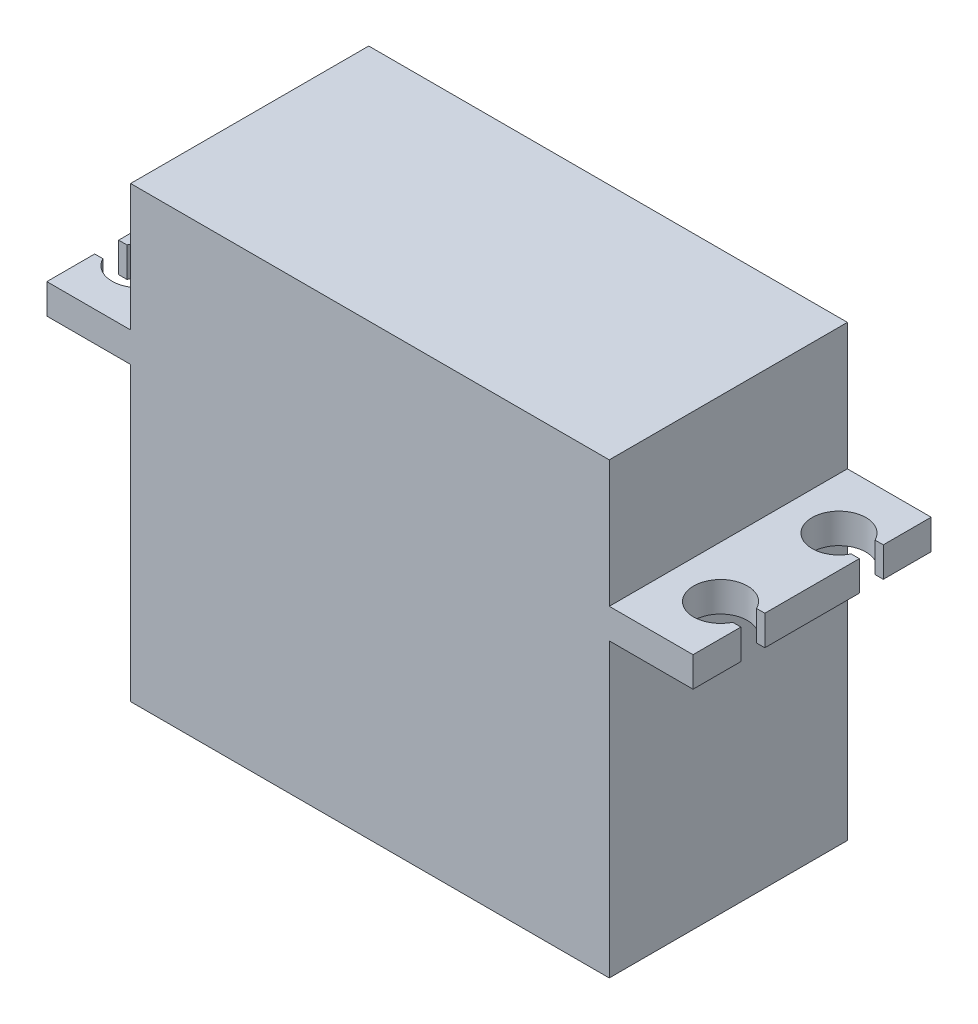
ISO-10303-21;
HEADER;
FILE_DESCRIPTION(('STEP AP214'),'2;1');
FILE_NAME('part.step','',(''),(''),'','','');
FILE_SCHEMA(('AUTOMOTIVE_DESIGN { 1 0 10303 214 1 1 1 1 }'));
ENDSEC;
DATA;
#1=APPLICATION_CONTEXT('core data for automotive mechanical design processes');
#2=APPLICATION_PROTOCOL_DEFINITION('international standard','automotive_design',2000,#1);
#3=PRODUCT_CONTEXT('',#1,'mechanical');
#4=PRODUCT('Part','Part','',(#3));
#5=PRODUCT_RELATED_PRODUCT_CATEGORY('part','',(#4));
#6=PRODUCT_DEFINITION_FORMATION('','',#4);
#7=PRODUCT_DEFINITION_CONTEXT('part definition',#1,'design');
#8=PRODUCT_DEFINITION('design','',#6,#7);
#9=PRODUCT_DEFINITION_SHAPE('','',#8);
#10=(LENGTH_UNIT() NAMED_UNIT(*) SI_UNIT(.MILLI.,.METRE.));
#11=(NAMED_UNIT(*) PLANE_ANGLE_UNIT() SI_UNIT($,.RADIAN.));
#12=(NAMED_UNIT(*) SI_UNIT($,.STERADIAN.) SOLID_ANGLE_UNIT());
#13=UNCERTAINTY_MEASURE_WITH_UNIT(LENGTH_MEASURE(1.E-05),#10,'distance_accuracy_value','');
#14=(GEOMETRIC_REPRESENTATION_CONTEXT(3) GLOBAL_UNCERTAINTY_ASSIGNED_CONTEXT((#13)) GLOBAL_UNIT_ASSIGNED_CONTEXT((#10,
#11,#12)) REPRESENTATION_CONTEXT('',''));
#15=CARTESIAN_POINT('',(0.,0.,0.));
#16=DIRECTION('',(0.,0.,1.));
#17=DIRECTION('',(1.,0.,0.));
#18=AXIS2_PLACEMENT_3D('',#15,#16,#17);
#19=CARTESIAN_POINT('',(-27.,5.65,0.));
#20=DIRECTION('',(1.,0.,0.));
#21=DIRECTION('',(0.,0.,-1.));
#22=AXIS2_PLACEMENT_3D('',#19,#20,#21);
#23=PLANE('',#22);
#24=DIRECTION('',(0.,0.,-1.));
#25=VECTOR('',#24,1.);
#26=CARTESIAN_POINT('',(-27.,8.15,0.));
#27=LINE('',#26,#25);
#28=CARTESIAN_POINT('',(-27.,8.15,19.9));
#29=VERTEX_POINT('',#28);
#30=CARTESIAN_POINT('',(-27.0000000000001,8.15,15.9));
#31=VERTEX_POINT('',#30);
#32=EDGE_CURVE('E383',#29,#31,#27,.T.);
#33=ORIENTED_EDGE('',*,*,#32,.T.);
#34=DIRECTION('',(0.,1.,0.));
#35=VECTOR('',#34,1.);
#36=CARTESIAN_POINT('',(-27.0000000000001,-18.75,15.9));
#37=LINE('',#36,#35);
#38=CARTESIAN_POINT('',(-27.0000000000001,5.64999999999999,15.9));
#39=VERTEX_POINT('',#38);
#40=EDGE_CURVE('E282',#39,#31,#37,.T.);
#41=ORIENTED_EDGE('',*,*,#40,.F.);
#42=DIRECTION('',(0.,0.,-1.));
#43=VECTOR('',#42,1.);
#44=CARTESIAN_POINT('',(-27.,5.65,0.));
#45=LINE('',#44,#43);
#46=CARTESIAN_POINT('',(-27.,5.65,19.9));
#47=VERTEX_POINT('',#46);
#48=EDGE_CURVE('E371',#47,#39,#45,.T.);
#49=ORIENTED_EDGE('',*,*,#48,.F.);
#50=DIRECTION('',(0.,1.,0.));
#51=VECTOR('',#50,1.);
#52=CARTESIAN_POINT('',(-27.,5.65,19.9));
#53=LINE('',#52,#51);
#54=EDGE_CURVE('E391',#47,#29,#53,.T.);
#55=ORIENTED_EDGE('',*,*,#54,.T.);
#56=EDGE_LOOP('',(#33,#41,#49,#55));
#57=FACE_BOUND('',#56,.T.);
#58=ADVANCED_FACE('F37',(#57),#23,.F.);
#59=CARTESIAN_POINT('',(-27.0000000000001,5.64999999999999,13.9));
#60=VERTEX_POINT('',#59);
#61=CARTESIAN_POINT('',(-27.0000000000001,5.64999999999999,6.));
#62=VERTEX_POINT('',#61);
#63=EDGE_CURVE('E375',#60,#62,#45,.T.);
#64=ORIENTED_EDGE('',*,*,#63,.F.);
#65=DIRECTION('',(0.,1.,0.));
#66=VECTOR('',#65,1.);
#67=CARTESIAN_POINT('',(-27.0000000000001,-18.75,13.9));
#68=LINE('',#67,#66);
#69=CARTESIAN_POINT('',(-27.0000000000001,8.15,13.9));
#70=VERTEX_POINT('',#69);
#71=EDGE_CURVE('E284',#60,#70,#68,.T.);
#72=ORIENTED_EDGE('',*,*,#71,.T.);
#73=CARTESIAN_POINT('',(-27.0000000000001,8.15,6.));
#74=VERTEX_POINT('',#73);
#75=EDGE_CURVE('E386',#70,#74,#27,.T.);
#76=ORIENTED_EDGE('',*,*,#75,.T.);
#77=DIRECTION('',(0.,1.,0.));
#78=VECTOR('',#77,1.);
#79=CARTESIAN_POINT('',(-27.0000000000001,-18.75,6.));
#80=LINE('',#79,#78);
#81=EDGE_CURVE('E268',#62,#74,#80,.T.);
#82=ORIENTED_EDGE('',*,*,#81,.F.);
#83=EDGE_LOOP('',(#64,#72,#76,#82));
#84=FACE_BOUND('',#83,.T.);
#85=ADVANCED_FACE('F485',(#84),#23,.F.);
#86=CARTESIAN_POINT('',(27.,5.65,0.));
#87=DIRECTION('',(-1.,0.,0.));
#88=DIRECTION('',(0.,0.,1.));
#89=AXIS2_PLACEMENT_3D('',#86,#87,#88);
#90=PLANE('',#89);
#91=DIRECTION('',(0.,0.,1.));
#92=VECTOR('',#91,1.);
#93=CARTESIAN_POINT('',(27.,5.65,0.));
#94=LINE('',#93,#92);
#95=CARTESIAN_POINT('',(27.,5.64999999999999,6.));
#96=VERTEX_POINT('',#95);
#97=CARTESIAN_POINT('',(27.,5.64999999999999,13.9));
#98=VERTEX_POINT('',#97);
#99=EDGE_CURVE('E345',#96,#98,#94,.T.);
#100=ORIENTED_EDGE('',*,*,#99,.F.);
#101=DIRECTION('',(0.,1.,0.));
#102=VECTOR('',#101,1.);
#103=CARTESIAN_POINT('',(27.,-18.75,6.));
#104=LINE('',#103,#102);
#105=CARTESIAN_POINT('',(27.,8.15,6.));
#106=VERTEX_POINT('',#105);
#107=EDGE_CURVE('E253',#96,#106,#104,.T.);
#108=ORIENTED_EDGE('',*,*,#107,.T.);
#109=DIRECTION('',(0.,0.,1.));
#110=VECTOR('',#109,1.);
#111=CARTESIAN_POINT('',(27.,8.15,0.));
#112=LINE('',#111,#110);
#113=CARTESIAN_POINT('',(27.,8.15,13.9));
#114=VERTEX_POINT('',#113);
#115=EDGE_CURVE('E355',#106,#114,#112,.T.);
#116=ORIENTED_EDGE('',*,*,#115,.T.);
#117=DIRECTION('',(0.,1.,0.));
#118=VECTOR('',#117,1.);
#119=CARTESIAN_POINT('',(27.,-18.75,13.9));
#120=LINE('',#119,#118);
#121=EDGE_CURVE('E295',#98,#114,#120,.T.);
#122=ORIENTED_EDGE('',*,*,#121,.F.);
#123=EDGE_LOOP('',(#100,#108,#116,#122));
#124=FACE_BOUND('',#123,.T.);
#125=ADVANCED_FACE('F506',(#124),#90,.F.);
#126=CARTESIAN_POINT('',(27.,5.64999999999999,15.9));
#127=VERTEX_POINT('',#126);
#128=CARTESIAN_POINT('',(27.,5.65,19.9));
#129=VERTEX_POINT('',#128);
#130=EDGE_CURVE('E340',#127,#129,#94,.T.);
#131=ORIENTED_EDGE('',*,*,#130,.F.);
#132=DIRECTION('',(0.,1.,0.));
#133=VECTOR('',#132,1.);
#134=CARTESIAN_POINT('',(27.,-18.75,15.9));
#135=LINE('',#134,#133);
#136=CARTESIAN_POINT('',(27.,8.15,15.9));
#137=VERTEX_POINT('',#136);
#138=EDGE_CURVE('E296',#127,#137,#135,.T.);
#139=ORIENTED_EDGE('',*,*,#138,.T.);
#140=CARTESIAN_POINT('',(27.,8.15,19.9));
#141=VERTEX_POINT('',#140);
#142=EDGE_CURVE('E352',#137,#141,#112,.T.);
#143=ORIENTED_EDGE('',*,*,#142,.T.);
#144=DIRECTION('',(0.,1.,0.));
#145=VECTOR('',#144,1.);
#146=CARTESIAN_POINT('',(27.,5.65,19.9));
#147=LINE('',#146,#145);
#148=EDGE_CURVE('E348',#129,#141,#147,.T.);
#149=ORIENTED_EDGE('',*,*,#148,.F.);
#150=EDGE_LOOP('',(#131,#139,#143,#149));
#151=FACE_BOUND('',#150,.T.);
#152=ADVANCED_FACE('F532',(#151),#90,.F.);
#153=CARTESIAN_POINT('',(20.,-18.75,19.9));
#154=DIRECTION('',(-1.,0.,0.));
#155=DIRECTION('',(0.,0.,1.));
#156=AXIS2_PLACEMENT_3D('',#153,#154,#155);
#157=PLANE('',#156);
#158=DIRECTION('',(0.,0.,-1.));
#159=VECTOR('',#158,1.);
#160=CARTESIAN_POINT('',(20.,5.65,19.9));
#161=LINE('',#160,#159);
#162=CARTESIAN_POINT('',(20.,5.65,19.9));
#163=VERTEX_POINT('',#162);
#164=CARTESIAN_POINT('',(20.,5.65,0.));
#165=VERTEX_POINT('',#164);
#166=EDGE_CURVE('E334',#163,#165,#161,.T.);
#167=ORIENTED_EDGE('',*,*,#166,.F.);
#168=DIRECTION('',(0.,1.,0.));
#169=VECTOR('',#168,1.);
#170=CARTESIAN_POINT('',(20.,-18.75,19.9));
#171=LINE('',#170,#169);
#172=CARTESIAN_POINT('',(20.,-18.75,19.9));
#173=VERTEX_POINT('',#172);
#174=EDGE_CURVE('E395',#173,#163,#171,.T.);
#175=ORIENTED_EDGE('',*,*,#174,.F.);
#176=DIRECTION('',(0.,0.,-1.));
#177=VECTOR('',#176,1.);
#178=CARTESIAN_POINT('',(20.,-18.75,19.9));
#179=LINE('',#178,#177);
#180=CARTESIAN_POINT('',(20.,-18.75,0.));
#181=VERTEX_POINT('',#180);
#182=EDGE_CURVE('E407',#173,#181,#179,.T.);
#183=ORIENTED_EDGE('',*,*,#182,.T.);
#184=DIRECTION('',(0.,1.,0.));
#185=VECTOR('',#184,1.);
#186=CARTESIAN_POINT('',(20.,-18.75,0.));
#187=LINE('',#186,#185);
#188=EDGE_CURVE('E408',#181,#165,#187,.T.);
#189=ORIENTED_EDGE('',*,*,#188,.T.);
#190=EDGE_LOOP('',(#167,#175,#183,#189));
#191=FACE_BOUND('',#190,.T.);
#192=ADVANCED_FACE('F465',(#191),#157,.F.);
#193=CARTESIAN_POINT('',(-20.,-18.75,19.9));
#194=DIRECTION('',(1.,0.,0.));
#195=DIRECTION('',(0.,0.,-1.));
#196=AXIS2_PLACEMENT_3D('',#193,#194,#195);
#197=PLANE('',#196);
#198=DIRECTION('',(0.,0.,1.));
#199=VECTOR('',#198,1.);
#200=CARTESIAN_POINT('',(-20.,5.65,19.9));
#201=LINE('',#200,#199);
#202=CARTESIAN_POINT('',(-20.,5.65,0.));
#203=VERTEX_POINT('',#202);
#204=CARTESIAN_POINT('',(-20.,5.65,19.9));
#205=VERTEX_POINT('',#204);
#206=EDGE_CURVE('E364',#203,#205,#201,.T.);
#207=ORIENTED_EDGE('',*,*,#206,.F.);
#208=DIRECTION('',(0.,-1.,0.));
#209=VECTOR('',#208,1.);
#210=CARTESIAN_POINT('',(-20.,-18.75,0.));
#211=LINE('',#210,#209);
#212=CARTESIAN_POINT('',(-20.,-18.75,0.));
#213=VERTEX_POINT('',#212);
#214=EDGE_CURVE('E412',#203,#213,#211,.T.);
#215=ORIENTED_EDGE('',*,*,#214,.T.);
#216=DIRECTION('',(0.,0.,-1.));
#217=VECTOR('',#216,1.);
#218=CARTESIAN_POINT('',(-20.,-18.75,19.9));
#219=LINE('',#218,#217);
#220=CARTESIAN_POINT('',(-20.,-18.75,19.9));
#221=VERTEX_POINT('',#220);
#222=EDGE_CURVE('E419',#221,#213,#219,.T.);
#223=ORIENTED_EDGE('',*,*,#222,.F.);
#224=DIRECTION('',(0.,-1.,0.));
#225=VECTOR('',#224,1.);
#226=CARTESIAN_POINT('',(-20.,-18.75,19.9));
#227=LINE('',#226,#225);
#228=EDGE_CURVE('E401',#205,#221,#227,.T.);
#229=ORIENTED_EDGE('',*,*,#228,.F.);
#230=EDGE_LOOP('',(#207,#215,#223,#229));
#231=FACE_BOUND('',#230,.T.);
#232=ADVANCED_FACE('F523',(#231),#197,.F.);
#233=CARTESIAN_POINT('',(20.,8.15,19.9));
#234=VERTEX_POINT('',#233);
#235=CARTESIAN_POINT('',(20.,18.75,19.9));
#236=VERTEX_POINT('',#235);
#237=EDGE_CURVE('E399',#234,#236,#171,.T.);
#238=ORIENTED_EDGE('',*,*,#237,.F.);
#239=DIRECTION('',(0.,0.,-1.));
#240=VECTOR('',#239,1.);
#241=CARTESIAN_POINT('',(20.,8.15,19.9));
#242=LINE('',#241,#240);
#243=CARTESIAN_POINT('',(20.,8.15,0.));
#244=VERTEX_POINT('',#243);
#245=EDGE_CURVE('E333',#234,#244,#242,.T.);
#246=ORIENTED_EDGE('',*,*,#245,.T.);
#247=CARTESIAN_POINT('',(20.,18.75,0.));
#248=VERTEX_POINT('',#247);
#249=EDGE_CURVE('E394',#244,#248,#187,.T.);
#250=ORIENTED_EDGE('',*,*,#249,.T.);
#251=DIRECTION('',(0.,0.,-1.));
#252=VECTOR('',#251,1.);
#253=CARTESIAN_POINT('',(20.,18.75,19.9));
#254=LINE('',#253,#252);
#255=EDGE_CURVE('E11',#236,#248,#254,.T.);
#256=ORIENTED_EDGE('',*,*,#255,.F.);
#257=EDGE_LOOP('',(#238,#246,#250,#256));
#258=FACE_BOUND('',#257,.T.);
#259=ADVANCED_FACE('F39',(#258),#157,.F.);
#260=CARTESIAN_POINT('',(-20.,18.75,19.9));
#261=DIRECTION('',(0.,-1.,0.));
#262=DIRECTION('',(0.,0.,-1.));
#263=AXIS2_PLACEMENT_3D('',#260,#261,#262);
#264=PLANE('',#263);
#265=DIRECTION('',(-1.,0.,0.));
#266=VECTOR('',#265,1.);
#267=CARTESIAN_POINT('',(-20.,18.75,0.));
#268=LINE('',#267,#266);
#269=CARTESIAN_POINT('',(-20.,18.75,0.));
#270=VERTEX_POINT('',#269);
#271=EDGE_CURVE('E410',#248,#270,#268,.T.);
#272=ORIENTED_EDGE('',*,*,#271,.T.);
#273=DIRECTION('',(0.,0.,-1.));
#274=VECTOR('',#273,1.);
#275=CARTESIAN_POINT('',(-20.,18.75,19.9));
#276=LINE('',#275,#274);
#277=CARTESIAN_POINT('',(-20.,18.75,19.9));
#278=VERTEX_POINT('',#277);
#279=EDGE_CURVE('E45',#278,#270,#276,.T.);
#280=ORIENTED_EDGE('',*,*,#279,.F.);
#281=DIRECTION('',(-1.,0.,0.));
#282=VECTOR('',#281,1.);
#283=CARTESIAN_POINT('',(-20.,18.75,19.9));
#284=LINE('',#283,#282);
#285=EDGE_CURVE('E398',#236,#278,#284,.T.);
#286=ORIENTED_EDGE('',*,*,#285,.F.);
#287=ORIENTED_EDGE('',*,*,#255,.T.);
#288=EDGE_LOOP('',(#272,#280,#286,#287));
#289=FACE_BOUND('',#288,.T.);
#290=ADVANCED_FACE('F448',(#289),#264,.F.);
#291=CARTESIAN_POINT('',(-20.,8.15,0.));
#292=VERTEX_POINT('',#291);
#293=EDGE_CURVE('E413',#270,#292,#211,.T.);
#294=ORIENTED_EDGE('',*,*,#293,.T.);
#295=DIRECTION('',(0.,0.,1.));
#296=VECTOR('',#295,1.);
#297=CARTESIAN_POINT('',(-20.,8.15,19.9));
#298=LINE('',#297,#296);
#299=CARTESIAN_POINT('',(-20.,8.15,19.9));
#300=VERTEX_POINT('',#299);
#301=EDGE_CURVE('E363',#292,#300,#298,.T.);
#302=ORIENTED_EDGE('',*,*,#301,.T.);
#303=EDGE_CURVE('E402',#278,#300,#227,.T.);
#304=ORIENTED_EDGE('',*,*,#303,.F.);
#305=ORIENTED_EDGE('',*,*,#279,.T.);
#306=EDGE_LOOP('',(#294,#302,#304,#305));
#307=FACE_BOUND('',#306,.T.);
#308=ADVANCED_FACE('F426',(#307),#197,.F.);
#309=CARTESIAN_POINT('',(-20.,-18.75,19.9));
#310=DIRECTION('',(0.,1.,0.));
#311=DIRECTION('',(0.,0.,1.));
#312=AXIS2_PLACEMENT_3D('',#309,#310,#311);
#313=PLANE('',#312);
#314=DIRECTION('',(1.,0.,0.));
#315=VECTOR('',#314,1.);
#316=CARTESIAN_POINT('',(-20.,-18.75,0.));
#317=LINE('',#316,#315);
#318=EDGE_CURVE('E415',#213,#181,#317,.T.);
#319=ORIENTED_EDGE('',*,*,#318,.T.);
#320=ORIENTED_EDGE('',*,*,#182,.F.);
#321=DIRECTION('',(1.,0.,0.));
#322=VECTOR('',#321,1.);
#323=CARTESIAN_POINT('',(-20.,-18.75,19.9));
#324=LINE('',#323,#322);
#325=EDGE_CURVE('E405',#221,#173,#324,.T.);
#326=ORIENTED_EDGE('',*,*,#325,.F.);
#327=ORIENTED_EDGE('',*,*,#222,.T.);
#328=EDGE_LOOP('',(#319,#320,#326,#327));
#329=FACE_BOUND('',#328,.T.);
#330=ADVANCED_FACE('F471',(#329),#313,.F.);
#331=CARTESIAN_POINT('',(0.,0.,19.9));
#332=DIRECTION('',(0.,0.,-1.));
#333=DIRECTION('',(-1.,0.,0.));
#334=AXIS2_PLACEMENT_3D('',#331,#332,#333);
#335=PLANE('',#334);
#336=ORIENTED_EDGE('',*,*,#174,.T.);
#337=DIRECTION('',(-1.,0.,0.));
#338=VECTOR('',#337,1.);
#339=CARTESIAN_POINT('',(27.,5.65,19.9));
#340=LINE('',#339,#338);
#341=EDGE_CURVE('E344',#129,#163,#340,.T.);
#342=ORIENTED_EDGE('',*,*,#341,.F.);
#343=ORIENTED_EDGE('',*,*,#148,.T.);
#344=DIRECTION('',(-1.,0.,0.));
#345=VECTOR('',#344,1.);
#346=CARTESIAN_POINT('',(27.,8.15,19.9));
#347=LINE('',#346,#345);
#348=EDGE_CURVE('E338',#141,#234,#347,.T.);
#349=ORIENTED_EDGE('',*,*,#348,.T.);
#350=ORIENTED_EDGE('',*,*,#237,.T.);
#351=ORIENTED_EDGE('',*,*,#285,.T.);
#352=ORIENTED_EDGE('',*,*,#303,.T.);
#353=DIRECTION('',(-1.,0.,0.));
#354=VECTOR('',#353,1.);
#355=CARTESIAN_POINT('',(-27.,8.15,19.9));
#356=LINE('',#355,#354);
#357=EDGE_CURVE('E380',#300,#29,#356,.T.);
#358=ORIENTED_EDGE('',*,*,#357,.T.);
#359=ORIENTED_EDGE('',*,*,#54,.F.);
#360=DIRECTION('',(-1.,0.,0.));
#361=VECTOR('',#360,1.);
#362=CARTESIAN_POINT('',(-27.,5.65,19.9));
#363=LINE('',#362,#361);
#364=EDGE_CURVE('E367',#205,#47,#363,.T.);
#365=ORIENTED_EDGE('',*,*,#364,.F.);
#366=ORIENTED_EDGE('',*,*,#228,.T.);
#367=ORIENTED_EDGE('',*,*,#325,.T.);
#368=EDGE_LOOP('',(#336,#342,#343,#349,#350,#351,#352,#358,#359,#365,#366,#367));
#369=FACE_BOUND('',#368,.T.);
#370=ADVANCED_FACE('F445',(#369),#335,.F.);
#371=CARTESIAN_POINT('',(0.,0.,0.));
#372=DIRECTION('',(0.,0.,-1.));
#373=DIRECTION('',(-1.,0.,0.));
#374=AXIS2_PLACEMENT_3D('',#371,#372,#373);
#375=PLANE('',#374);
#376=ORIENTED_EDGE('',*,*,#188,.F.);
#377=ORIENTED_EDGE('',*,*,#318,.F.);
#378=ORIENTED_EDGE('',*,*,#214,.F.);
#379=DIRECTION('',(1.,0.,0.));
#380=VECTOR('',#379,1.);
#381=CARTESIAN_POINT('',(-20.,5.65,0.));
#382=LINE('',#381,#380);
#383=CARTESIAN_POINT('',(-27.,5.65,0.));
#384=VERTEX_POINT('',#383);
#385=EDGE_CURVE('E374',#384,#203,#382,.T.);
#386=ORIENTED_EDGE('',*,*,#385,.F.);
#387=DIRECTION('',(0.,1.,0.));
#388=VECTOR('',#387,1.);
#389=CARTESIAN_POINT('',(-27.,5.65,0.));
#390=LINE('',#389,#388);
#391=CARTESIAN_POINT('',(-27.,8.15,0.));
#392=VERTEX_POINT('',#391);
#393=EDGE_CURVE('E378',#384,#392,#390,.T.);
#394=ORIENTED_EDGE('',*,*,#393,.T.);
#395=DIRECTION('',(1.,0.,0.));
#396=VECTOR('',#395,1.);
#397=CARTESIAN_POINT('',(-20.,8.15,0.));
#398=LINE('',#397,#396);
#399=EDGE_CURVE('E368',#392,#292,#398,.T.);
#400=ORIENTED_EDGE('',*,*,#399,.T.);
#401=ORIENTED_EDGE('',*,*,#293,.F.);
#402=ORIENTED_EDGE('',*,*,#271,.F.);
#403=ORIENTED_EDGE('',*,*,#249,.F.);
#404=DIRECTION('',(1.,0.,0.));
#405=VECTOR('',#404,1.);
#406=CARTESIAN_POINT('',(20.,8.15,0.));
#407=LINE('',#406,#405);
#408=CARTESIAN_POINT('',(27.,8.15,0.));
#409=VERTEX_POINT('',#408);
#410=EDGE_CURVE('E350',#244,#409,#407,.T.);
#411=ORIENTED_EDGE('',*,*,#410,.T.);
#412=DIRECTION('',(0.,1.,0.));
#413=VECTOR('',#412,1.);
#414=CARTESIAN_POINT('',(27.,5.65,0.));
#415=LINE('',#414,#413);
#416=CARTESIAN_POINT('',(27.,5.65,0.));
#417=VERTEX_POINT('',#416);
#418=EDGE_CURVE('E360',#417,#409,#415,.T.);
#419=ORIENTED_EDGE('',*,*,#418,.F.);
#420=DIRECTION('',(1.,0.,0.));
#421=VECTOR('',#420,1.);
#422=CARTESIAN_POINT('',(20.,5.65,0.));
#423=LINE('',#422,#421);
#424=EDGE_CURVE('E337',#165,#417,#423,.T.);
#425=ORIENTED_EDGE('',*,*,#424,.F.);
#426=EDGE_LOOP('',(#376,#377,#378,#386,#394,#400,#401,#402,#403,#411,#419,#425));
#427=FACE_BOUND('',#426,.T.);
#428=ADVANCED_FACE('F432',(#427),#375,.T.);
#429=CARTESIAN_POINT('',(-27.0000000000001,5.64999999999999,4.));
#430=VERTEX_POINT('',#429);
#431=EDGE_CURVE('E370',#430,#384,#45,.T.);
#432=ORIENTED_EDGE('',*,*,#431,.F.);
#433=DIRECTION('',(0.,1.,0.));
#434=VECTOR('',#433,1.);
#435=CARTESIAN_POINT('',(-27.0000000000001,-18.75,4.));
#436=LINE('',#435,#434);
#437=CARTESIAN_POINT('',(-27.0000000000001,8.15,4.));
#438=VERTEX_POINT('',#437);
#439=EDGE_CURVE('E270',#430,#438,#436,.T.);
#440=ORIENTED_EDGE('',*,*,#439,.T.);
#441=EDGE_CURVE('E382',#438,#392,#27,.T.);
#442=ORIENTED_EDGE('',*,*,#441,.T.);
#443=ORIENTED_EDGE('',*,*,#393,.F.);
#444=EDGE_LOOP('',(#432,#440,#442,#443));
#445=FACE_BOUND('',#444,.T.);
#446=ADVANCED_FACE('F478',(#445),#23,.F.);
#447=CARTESIAN_POINT('',(0.,5.65,0.));
#448=DIRECTION('',(0.,1.,0.));
#449=DIRECTION('',(0.,0.,1.));
#450=AXIS2_PLACEMENT_3D('',#447,#448,#449);
#451=PLANE('',#450);
#452=ORIENTED_EDGE('',*,*,#48,.T.);
#453=DIRECTION('',(1.,0.,0.));
#454=VECTOR('',#453,1.);
#455=CARTESIAN_POINT('',(0.,5.65,15.8999999999999));
#456=LINE('',#455,#454);
#457=CARTESIAN_POINT('',(-26.3155644370746,5.64999999999999,15.9));
#458=VERTEX_POINT('',#457);
#459=EDGE_CURVE('E327',#39,#458,#456,.T.);
#460=ORIENTED_EDGE('',*,*,#459,.T.);
#461=CARTESIAN_POINT('',(-24.3,5.65,14.9));
#462=DIRECTION('',(0.,1.,0.));
#463=DIRECTION('',(0.,0.,1.));
#464=AXIS2_PLACEMENT_3D('',#461,#462,#463);
#465=CIRCLE('',#464,2.25);
#466=CARTESIAN_POINT('',(-26.3155644370746,5.64999999999999,13.9));
#467=VERTEX_POINT('',#466);
#468=EDGE_CURVE('E330',#458,#467,#465,.T.);
#469=ORIENTED_EDGE('',*,*,#468,.T.);
#470=DIRECTION('',(-1.,0.,0.));
#471=VECTOR('',#470,1.);
#472=CARTESIAN_POINT('',(0.,5.65,13.9));
#473=LINE('',#472,#471);
#474=EDGE_CURVE('E324',#467,#60,#473,.T.);
#475=ORIENTED_EDGE('',*,*,#474,.T.);
#476=ORIENTED_EDGE('',*,*,#63,.T.);
#477=DIRECTION('',(1.,0.,0.));
#478=VECTOR('',#477,1.);
#479=CARTESIAN_POINT('',(0.,5.65,6.0000000000001));
#480=LINE('',#479,#478);
#481=CARTESIAN_POINT('',(-26.3155644370746,5.64999999999999,6.));
#482=VERTEX_POINT('',#481);
#483=EDGE_CURVE('E318',#62,#482,#480,.T.);
#484=ORIENTED_EDGE('',*,*,#483,.T.);
#485=CARTESIAN_POINT('',(-24.3,5.65,5.));
#486=DIRECTION('',(0.,1.,0.));
#487=DIRECTION('',(0.,0.,1.));
#488=AXIS2_PLACEMENT_3D('',#485,#486,#487);
#489=CIRCLE('',#488,2.25);
#490=CARTESIAN_POINT('',(-26.3155644370746,5.64999999999999,4.));
#491=VERTEX_POINT('',#490);
#492=EDGE_CURVE('E321',#482,#491,#489,.T.);
#493=ORIENTED_EDGE('',*,*,#492,.T.);
#494=DIRECTION('',(-1.,0.,0.));
#495=VECTOR('',#494,1.);
#496=CARTESIAN_POINT('',(0.,5.65,4.00000000000003));
#497=LINE('',#496,#495);
#498=EDGE_CURVE('E315',#491,#430,#497,.T.);
#499=ORIENTED_EDGE('',*,*,#498,.T.);
#500=ORIENTED_EDGE('',*,*,#431,.T.);
#501=ORIENTED_EDGE('',*,*,#385,.T.);
#502=ORIENTED_EDGE('',*,*,#206,.T.);
#503=ORIENTED_EDGE('',*,*,#364,.T.);
#504=EDGE_LOOP('',(#452,#460,#469,#475,#476,#484,#493,#499,#500,#501,#502,#503));
#505=FACE_BOUND('',#504,.T.);
#506=ADVANCED_FACE('F475',(#505),#451,.F.);
#507=CARTESIAN_POINT('',(0.,8.15,0.));
#508=DIRECTION('',(0.,1.,0.));
#509=DIRECTION('',(0.,0.,1.));
#510=AXIS2_PLACEMENT_3D('',#507,#508,#509);
#511=PLANE('',#510);
#512=DIRECTION('',(1.,0.,0.));
#513=VECTOR('',#512,1.);
#514=CARTESIAN_POINT('',(-27.0000000000001,8.15,15.9));
#515=LINE('',#514,#513);
#516=CARTESIAN_POINT('',(-26.3155644370746,8.15,15.9));
#517=VERTEX_POINT('',#516);
#518=EDGE_CURVE('E277',#31,#517,#515,.T.);
#519=ORIENTED_EDGE('',*,*,#518,.F.);
#520=ORIENTED_EDGE('',*,*,#32,.F.);
#521=ORIENTED_EDGE('',*,*,#357,.F.);
#522=ORIENTED_EDGE('',*,*,#301,.F.);
#523=ORIENTED_EDGE('',*,*,#399,.F.);
#524=ORIENTED_EDGE('',*,*,#441,.F.);
#525=DIRECTION('',(-1.,0.,0.));
#526=VECTOR('',#525,1.);
#527=CARTESIAN_POINT('',(-27.0000000000001,8.15,4.));
#528=LINE('',#527,#526);
#529=CARTESIAN_POINT('',(-26.3155644370746,8.15,4.));
#530=VERTEX_POINT('',#529);
#531=EDGE_CURVE('E260',#530,#438,#528,.T.);
#532=ORIENTED_EDGE('',*,*,#531,.F.);
#533=CARTESIAN_POINT('',(-24.3,8.15,5.));
#534=DIRECTION('',(0.,1.,0.));
#535=DIRECTION('',(0.,0.,-1.));
#536=AXIS2_PLACEMENT_3D('',#533,#534,#535);
#537=CIRCLE('',#536,2.25);
#538=CARTESIAN_POINT('',(-26.3155644370746,8.15,6.));
#539=VERTEX_POINT('',#538);
#540=EDGE_CURVE('E60',#539,#530,#537,.T.);
#541=ORIENTED_EDGE('',*,*,#540,.F.);
#542=DIRECTION('',(1.,0.,0.));
#543=VECTOR('',#542,1.);
#544=CARTESIAN_POINT('',(-27.0000000000001,8.15,6.));
#545=LINE('',#544,#543);
#546=EDGE_CURVE('E263',#74,#539,#545,.T.);
#547=ORIENTED_EDGE('',*,*,#546,.F.);
#548=ORIENTED_EDGE('',*,*,#75,.F.);
#549=DIRECTION('',(-1.,0.,0.));
#550=VECTOR('',#549,1.);
#551=CARTESIAN_POINT('',(-27.0000000000001,8.15,13.9));
#552=LINE('',#551,#550);
#553=CARTESIAN_POINT('',(-26.3155644370746,8.15,13.9));
#554=VERTEX_POINT('',#553);
#555=EDGE_CURVE('E275',#554,#70,#552,.T.);
#556=ORIENTED_EDGE('',*,*,#555,.F.);
#557=CARTESIAN_POINT('',(-24.3,8.15,14.9));
#558=DIRECTION('',(0.,1.,0.));
#559=DIRECTION('',(0.,0.,-1.));
#560=AXIS2_PLACEMENT_3D('',#557,#558,#559);
#561=CIRCLE('',#560,2.25);
#562=EDGE_CURVE('E52',#517,#554,#561,.T.);
#563=ORIENTED_EDGE('',*,*,#562,.F.);
#564=EDGE_LOOP('',(#519,#520,#521,#522,#523,#524,#532,#541,#547,#548,#556,#563));
#565=FACE_BOUND('',#564,.T.);
#566=ADVANCED_FACE('F442',(#565),#511,.T.);
#567=CARTESIAN_POINT('',(27.,8.15,4.));
#568=VERTEX_POINT('',#567);
#569=EDGE_CURVE('E353',#409,#568,#112,.T.);
#570=ORIENTED_EDGE('',*,*,#569,.T.);
#571=DIRECTION('',(0.,1.,0.));
#572=VECTOR('',#571,1.);
#573=CARTESIAN_POINT('',(27.,-18.75,4.));
#574=LINE('',#573,#572);
#575=CARTESIAN_POINT('',(27.,5.64999999999999,4.));
#576=VERTEX_POINT('',#575);
#577=EDGE_CURVE('E236',#576,#568,#574,.T.);
#578=ORIENTED_EDGE('',*,*,#577,.F.);
#579=EDGE_CURVE('E341',#417,#576,#94,.T.);
#580=ORIENTED_EDGE('',*,*,#579,.F.);
#581=ORIENTED_EDGE('',*,*,#418,.T.);
#582=EDGE_LOOP('',(#570,#578,#580,#581));
#583=FACE_BOUND('',#582,.T.);
#584=ADVANCED_FACE('F455',(#583),#90,.F.);
#585=CARTESIAN_POINT('',(0.,5.65,0.));
#586=DIRECTION('',(0.,-1.,0.));
#587=DIRECTION('',(0.,0.,-1.));
#588=AXIS2_PLACEMENT_3D('',#585,#586,#587);
#589=PLANE('',#588);
#590=DIRECTION('',(-1.,0.,0.));
#591=VECTOR('',#590,1.);
#592=CARTESIAN_POINT('',(0.,5.65,6.0000000000001));
#593=LINE('',#592,#591);
#594=CARTESIAN_POINT('',(26.3155644370746,5.64999999999999,6.));
#595=VERTEX_POINT('',#594);
#596=EDGE_CURVE('E313',#96,#595,#593,.T.);
#597=ORIENTED_EDGE('',*,*,#596,.F.);
#598=ORIENTED_EDGE('',*,*,#99,.T.);
#599=DIRECTION('',(1.,0.,0.));
#600=VECTOR('',#599,1.);
#601=CARTESIAN_POINT('',(0.,5.65,13.9));
#602=LINE('',#601,#600);
#603=CARTESIAN_POINT('',(26.3155644370746,5.64999999999999,13.9));
#604=VERTEX_POINT('',#603);
#605=EDGE_CURVE('E299',#604,#98,#602,.T.);
#606=ORIENTED_EDGE('',*,*,#605,.F.);
#607=CARTESIAN_POINT('',(24.3,5.65,14.9));
#608=DIRECTION('',(0.,-1.,0.));
#609=DIRECTION('',(0.,0.,-1.));
#610=AXIS2_PLACEMENT_3D('',#607,#608,#609);
#611=CIRCLE('',#610,2.25);
#612=CARTESIAN_POINT('',(26.3155644370746,5.64999999999999,15.9));
#613=VERTEX_POINT('',#612);
#614=EDGE_CURVE('E306',#613,#604,#611,.T.);
#615=ORIENTED_EDGE('',*,*,#614,.F.);
#616=DIRECTION('',(-1.,0.,0.));
#617=VECTOR('',#616,1.);
#618=CARTESIAN_POINT('',(0.,5.65,15.8999999999999));
#619=LINE('',#618,#617);
#620=EDGE_CURVE('E308',#127,#613,#619,.T.);
#621=ORIENTED_EDGE('',*,*,#620,.F.);
#622=ORIENTED_EDGE('',*,*,#130,.T.);
#623=ORIENTED_EDGE('',*,*,#341,.T.);
#624=ORIENTED_EDGE('',*,*,#166,.T.);
#625=ORIENTED_EDGE('',*,*,#424,.T.);
#626=ORIENTED_EDGE('',*,*,#579,.T.);
#627=DIRECTION('',(1.,0.,0.));
#628=VECTOR('',#627,1.);
#629=CARTESIAN_POINT('',(0.,5.65,4.00000000000003));
#630=LINE('',#629,#628);
#631=CARTESIAN_POINT('',(26.3155644370746,5.64999999999999,4.));
#632=VERTEX_POINT('',#631);
#633=EDGE_CURVE('E310',#632,#576,#630,.T.);
#634=ORIENTED_EDGE('',*,*,#633,.F.);
#635=CARTESIAN_POINT('',(24.3,5.65,5.));
#636=DIRECTION('',(0.,-1.,0.));
#637=DIRECTION('',(0.,0.,-1.));
#638=AXIS2_PLACEMENT_3D('',#635,#636,#637);
#639=CIRCLE('',#638,2.25);
#640=EDGE_CURVE('E232',#595,#632,#639,.T.);
#641=ORIENTED_EDGE('',*,*,#640,.F.);
#642=EDGE_LOOP('',(#597,#598,#606,#615,#621,#622,#623,#624,#625,#626,#634,#641));
#643=FACE_BOUND('',#642,.T.);
#644=ADVANCED_FACE('F461',(#643),#589,.T.);
#645=CARTESIAN_POINT('',(0.,8.15,0.));
#646=DIRECTION('',(0.,-1.,0.));
#647=DIRECTION('',(0.,0.,-1.));
#648=AXIS2_PLACEMENT_3D('',#645,#646,#647);
#649=PLANE('',#648);
#650=ORIENTED_EDGE('',*,*,#115,.F.);
#651=DIRECTION('',(1.,0.,0.));
#652=VECTOR('',#651,1.);
#653=CARTESIAN_POINT('',(27.,8.15,6.));
#654=LINE('',#653,#652);
#655=CARTESIAN_POINT('',(26.3155644370746,8.15,6.));
#656=VERTEX_POINT('',#655);
#657=EDGE_CURVE('E249',#656,#106,#654,.T.);
#658=ORIENTED_EDGE('',*,*,#657,.F.);
#659=CARTESIAN_POINT('',(24.3,8.15,5.));
#660=DIRECTION('',(0.,1.,0.));
#661=DIRECTION('',(0.,0.,1.));
#662=AXIS2_PLACEMENT_3D('',#659,#660,#661);
#663=CIRCLE('',#662,2.25);
#664=CARTESIAN_POINT('',(26.3155644370746,8.15,4.));
#665=VERTEX_POINT('',#664);
#666=EDGE_CURVE('E229',#665,#656,#663,.T.);
#667=ORIENTED_EDGE('',*,*,#666,.F.);
#668=DIRECTION('',(-1.,0.,0.));
#669=VECTOR('',#668,1.);
#670=CARTESIAN_POINT('',(27.,8.15,4.));
#671=LINE('',#670,#669);
#672=EDGE_CURVE('E239',#568,#665,#671,.T.);
#673=ORIENTED_EDGE('',*,*,#672,.F.);
#674=ORIENTED_EDGE('',*,*,#569,.F.);
#675=ORIENTED_EDGE('',*,*,#410,.F.);
#676=ORIENTED_EDGE('',*,*,#245,.F.);
#677=ORIENTED_EDGE('',*,*,#348,.F.);
#678=ORIENTED_EDGE('',*,*,#142,.F.);
#679=DIRECTION('',(1.,0.,0.));
#680=VECTOR('',#679,1.);
#681=CARTESIAN_POINT('',(27.,8.15,15.9));
#682=LINE('',#681,#680);
#683=CARTESIAN_POINT('',(26.3155644370746,8.15,15.9));
#684=VERTEX_POINT('',#683);
#685=EDGE_CURVE('E293',#684,#137,#682,.T.);
#686=ORIENTED_EDGE('',*,*,#685,.F.);
#687=CARTESIAN_POINT('',(24.3,8.15,14.9));
#688=DIRECTION('',(0.,1.,0.));
#689=DIRECTION('',(0.,0.,1.));
#690=AXIS2_PLACEMENT_3D('',#687,#688,#689);
#691=CIRCLE('',#690,2.25);
#692=CARTESIAN_POINT('',(26.3155644370746,8.15,13.9));
#693=VERTEX_POINT('',#692);
#694=EDGE_CURVE('E290',#693,#684,#691,.T.);
#695=ORIENTED_EDGE('',*,*,#694,.F.);
#696=DIRECTION('',(-1.,0.,0.));
#697=VECTOR('',#696,1.);
#698=CARTESIAN_POINT('',(27.,8.15,13.9));
#699=LINE('',#698,#697);
#700=EDGE_CURVE('E256',#114,#693,#699,.T.);
#701=ORIENTED_EDGE('',*,*,#700,.F.);
#702=EDGE_LOOP('',(#650,#658,#667,#673,#674,#675,#676,#677,#678,#686,#695,#701));
#703=FACE_BOUND('',#702,.T.);
#704=ADVANCED_FACE('F248',(#703),#649,.F.);
#705=CARTESIAN_POINT('',(27.,-18.75,15.9));
#706=DIRECTION('',(0.,0.,1.));
#707=DIRECTION('',(1.,0.,0.));
#708=AXIS2_PLACEMENT_3D('',#705,#706,#707);
#709=PLANE('',#708);
#710=ORIENTED_EDGE('',*,*,#620,.T.);
#711=DIRECTION('',(0.,1.,0.));
#712=VECTOR('',#711,1.);
#713=CARTESIAN_POINT('',(26.3155644370746,-18.75,15.9));
#714=LINE('',#713,#712);
#715=EDGE_CURVE('E300',#613,#684,#714,.T.);
#716=ORIENTED_EDGE('',*,*,#715,.T.);
#717=ORIENTED_EDGE('',*,*,#685,.T.);
#718=ORIENTED_EDGE('',*,*,#138,.F.);
#719=EDGE_LOOP('',(#710,#716,#717,#718));
#720=FACE_BOUND('',#719,.T.);
#721=ADVANCED_FACE('F638',(#720),#709,.F.);
#722=CARTESIAN_POINT('',(24.3,-18.75,14.9));
#723=DIRECTION('',(0.,1.,0.));
#724=DIRECTION('',(0.,0.,1.));
#725=AXIS2_PLACEMENT_3D('',#722,#723,#724);
#726=CYLINDRICAL_SURFACE('',#725,2.25);
#727=ORIENTED_EDGE('',*,*,#614,.T.);
#728=DIRECTION('',(0.,1.,0.));
#729=VECTOR('',#728,1.);
#730=CARTESIAN_POINT('',(26.3155644370746,-18.75,13.9));
#731=LINE('',#730,#729);
#732=EDGE_CURVE('E302',#604,#693,#731,.T.);
#733=ORIENTED_EDGE('',*,*,#732,.T.);
#734=ORIENTED_EDGE('',*,*,#694,.T.);
#735=ORIENTED_EDGE('',*,*,#715,.F.);
#736=EDGE_LOOP('',(#727,#733,#734,#735));
#737=FACE_BOUND('',#736,.T.);
#738=ADVANCED_FACE('F644',(#737),#726,.F.);
#739=CARTESIAN_POINT('',(27.,-18.75,13.9));
#740=DIRECTION('',(0.,0.,-1.));
#741=DIRECTION('',(-1.,0.,0.));
#742=AXIS2_PLACEMENT_3D('',#739,#740,#741);
#743=PLANE('',#742);
#744=ORIENTED_EDGE('',*,*,#605,.T.);
#745=ORIENTED_EDGE('',*,*,#121,.T.);
#746=ORIENTED_EDGE('',*,*,#700,.T.);
#747=ORIENTED_EDGE('',*,*,#732,.F.);
#748=EDGE_LOOP('',(#744,#745,#746,#747));
#749=FACE_BOUND('',#748,.T.);
#750=ADVANCED_FACE('F654',(#749),#743,.F.);
#751=CARTESIAN_POINT('',(27.,-18.75,6.));
#752=DIRECTION('',(0.,0.,1.));
#753=DIRECTION('',(1.,0.,0.));
#754=AXIS2_PLACEMENT_3D('',#751,#752,#753);
#755=PLANE('',#754);
#756=ORIENTED_EDGE('',*,*,#596,.T.);
#757=DIRECTION('',(0.,1.,0.));
#758=VECTOR('',#757,1.);
#759=CARTESIAN_POINT('',(26.3155644370746,-18.75,6.));
#760=LINE('',#759,#758);
#761=EDGE_CURVE('E235',#595,#656,#760,.T.);
#762=ORIENTED_EDGE('',*,*,#761,.T.);
#763=ORIENTED_EDGE('',*,*,#657,.T.);
#764=ORIENTED_EDGE('',*,*,#107,.F.);
#765=EDGE_LOOP('',(#756,#762,#763,#764));
#766=FACE_BOUND('',#765,.T.);
#767=ADVANCED_FACE('F663',(#766),#755,.F.);
#768=CARTESIAN_POINT('',(24.3,-18.75,5.));
#769=DIRECTION('',(0.,1.,0.));
#770=DIRECTION('',(0.,0.,1.));
#771=AXIS2_PLACEMENT_3D('',#768,#769,#770);
#772=CYLINDRICAL_SURFACE('',#771,2.25);
#773=ORIENTED_EDGE('',*,*,#640,.T.);
#774=DIRECTION('',(0.,1.,0.));
#775=VECTOR('',#774,1.);
#776=CARTESIAN_POINT('',(26.3155644370746,-18.75,4.));
#777=LINE('',#776,#775);
#778=EDGE_CURVE('E224',#632,#665,#777,.T.);
#779=ORIENTED_EDGE('',*,*,#778,.T.);
#780=ORIENTED_EDGE('',*,*,#666,.T.);
#781=ORIENTED_EDGE('',*,*,#761,.F.);
#782=EDGE_LOOP('',(#773,#779,#780,#781));
#783=FACE_BOUND('',#782,.T.);
#784=ADVANCED_FACE('F226',(#783),#772,.F.);
#785=CARTESIAN_POINT('',(27.,-18.75,4.));
#786=DIRECTION('',(0.,0.,-1.));
#787=DIRECTION('',(-1.,0.,0.));
#788=AXIS2_PLACEMENT_3D('',#785,#786,#787);
#789=PLANE('',#788);
#790=ORIENTED_EDGE('',*,*,#633,.T.);
#791=ORIENTED_EDGE('',*,*,#577,.T.);
#792=ORIENTED_EDGE('',*,*,#672,.T.);
#793=ORIENTED_EDGE('',*,*,#778,.F.);
#794=EDGE_LOOP('',(#790,#791,#792,#793));
#795=FACE_BOUND('',#794,.T.);
#796=ADVANCED_FACE('F240',(#795),#789,.F.);
#797=CARTESIAN_POINT('',(-24.3,-18.75,5.));
#798=DIRECTION('',(0.,1.,0.));
#799=DIRECTION('',(0.,0.,1.));
#800=AXIS2_PLACEMENT_3D('',#797,#798,#799);
#801=CYLINDRICAL_SURFACE('',#800,2.25);
#802=DIRECTION('',(0.,1.,0.));
#803=VECTOR('',#802,1.);
#804=CARTESIAN_POINT('',(-26.3155644370746,-18.75,6.));
#805=LINE('',#804,#803);
#806=EDGE_CURVE('E245',#482,#539,#805,.T.);
#807=ORIENTED_EDGE('',*,*,#806,.T.);
#808=ORIENTED_EDGE('',*,*,#540,.T.);
#809=DIRECTION('',(0.,1.,0.));
#810=VECTOR('',#809,1.);
#811=CARTESIAN_POINT('',(-26.3155644370746,-18.75,4.));
#812=LINE('',#811,#810);
#813=EDGE_CURVE('E266',#491,#530,#812,.T.);
#814=ORIENTED_EDGE('',*,*,#813,.F.);
#815=ORIENTED_EDGE('',*,*,#492,.F.);
#816=EDGE_LOOP('',(#807,#808,#814,#815));
#817=FACE_BOUND('',#816,.T.);
#818=ADVANCED_FACE('F687',(#817),#801,.F.);
#819=CARTESIAN_POINT('',(-27.0000000000001,-18.75,6.));
#820=DIRECTION('',(0.,0.,1.));
#821=DIRECTION('',(1.,0.,0.));
#822=AXIS2_PLACEMENT_3D('',#819,#820,#821);
#823=PLANE('',#822);
#824=ORIENTED_EDGE('',*,*,#81,.T.);
#825=ORIENTED_EDGE('',*,*,#546,.T.);
#826=ORIENTED_EDGE('',*,*,#806,.F.);
#827=ORIENTED_EDGE('',*,*,#483,.F.);
#828=EDGE_LOOP('',(#824,#825,#826,#827));
#829=FACE_BOUND('',#828,.T.);
#830=ADVANCED_FACE('F491',(#829),#823,.F.);
#831=CARTESIAN_POINT('',(-27.0000000000001,-18.75,4.));
#832=DIRECTION('',(0.,0.,-1.));
#833=DIRECTION('',(-1.,0.,0.));
#834=AXIS2_PLACEMENT_3D('',#831,#832,#833);
#835=PLANE('',#834);
#836=ORIENTED_EDGE('',*,*,#813,.T.);
#837=ORIENTED_EDGE('',*,*,#531,.T.);
#838=ORIENTED_EDGE('',*,*,#439,.F.);
#839=ORIENTED_EDGE('',*,*,#498,.F.);
#840=EDGE_LOOP('',(#836,#837,#838,#839));
#841=FACE_BOUND('',#840,.T.);
#842=ADVANCED_FACE('F702',(#841),#835,.F.);
#843=CARTESIAN_POINT('',(-24.3,-18.75,14.9));
#844=DIRECTION('',(0.,1.,0.));
#845=DIRECTION('',(0.,0.,1.));
#846=AXIS2_PLACEMENT_3D('',#843,#844,#845);
#847=CYLINDRICAL_SURFACE('',#846,2.25);
#848=DIRECTION('',(0.,1.,0.));
#849=VECTOR('',#848,1.);
#850=CARTESIAN_POINT('',(-26.3155644370746,-18.75,15.9));
#851=LINE('',#850,#849);
#852=EDGE_CURVE('E261',#458,#517,#851,.T.);
#853=ORIENTED_EDGE('',*,*,#852,.T.);
#854=ORIENTED_EDGE('',*,*,#562,.T.);
#855=DIRECTION('',(0.,1.,0.));
#856=VECTOR('',#855,1.);
#857=CARTESIAN_POINT('',(-26.3155644370746,-18.75,13.9));
#858=LINE('',#857,#856);
#859=EDGE_CURVE('E280',#467,#554,#858,.T.);
#860=ORIENTED_EDGE('',*,*,#859,.F.);
#861=ORIENTED_EDGE('',*,*,#468,.F.);
#862=EDGE_LOOP('',(#853,#854,#860,#861));
#863=FACE_BOUND('',#862,.T.);
#864=ADVANCED_FACE('F494',(#863),#847,.F.);
#865=CARTESIAN_POINT('',(-27.0000000000001,-18.75,15.9));
#866=DIRECTION('',(0.,0.,1.));
#867=DIRECTION('',(1.,0.,0.));
#868=AXIS2_PLACEMENT_3D('',#865,#866,#867);
#869=PLANE('',#868);
#870=ORIENTED_EDGE('',*,*,#40,.T.);
#871=ORIENTED_EDGE('',*,*,#518,.T.);
#872=ORIENTED_EDGE('',*,*,#852,.F.);
#873=ORIENTED_EDGE('',*,*,#459,.F.);
#874=EDGE_LOOP('',(#870,#871,#872,#873));
#875=FACE_BOUND('',#874,.T.);
#876=ADVANCED_FACE('F497',(#875),#869,.F.);
#877=CARTESIAN_POINT('',(-27.0000000000001,-18.75,13.9));
#878=DIRECTION('',(0.,0.,-1.));
#879=DIRECTION('',(-1.,0.,0.));
#880=AXIS2_PLACEMENT_3D('',#877,#878,#879);
#881=PLANE('',#880);
#882=ORIENTED_EDGE('',*,*,#859,.T.);
#883=ORIENTED_EDGE('',*,*,#555,.T.);
#884=ORIENTED_EDGE('',*,*,#71,.F.);
#885=ORIENTED_EDGE('',*,*,#474,.F.);
#886=EDGE_LOOP('',(#882,#883,#884,#885));
#887=FACE_BOUND('',#886,.T.);
#888=ADVANCED_FACE('F493',(#887),#881,.F.);
#889=CLOSED_SHELL('',(#58,#85,#125,#152,#192,#232,#259,#290,#308,#330,#370,#428,#446,#506,#566,
#584,#644,#704,#721,#738,#750,#767,#784,#796,#818,#830,#842,#864,#876,#888));
#890=MANIFOLD_SOLID_BREP('B2',#889);
#891=ADVANCED_BREP_SHAPE_REPRESENTATION('',(#18,#890),#14);
#892=SHAPE_DEFINITION_REPRESENTATION(#9,#891);
ENDSEC;
END-ISO-10303-21;
